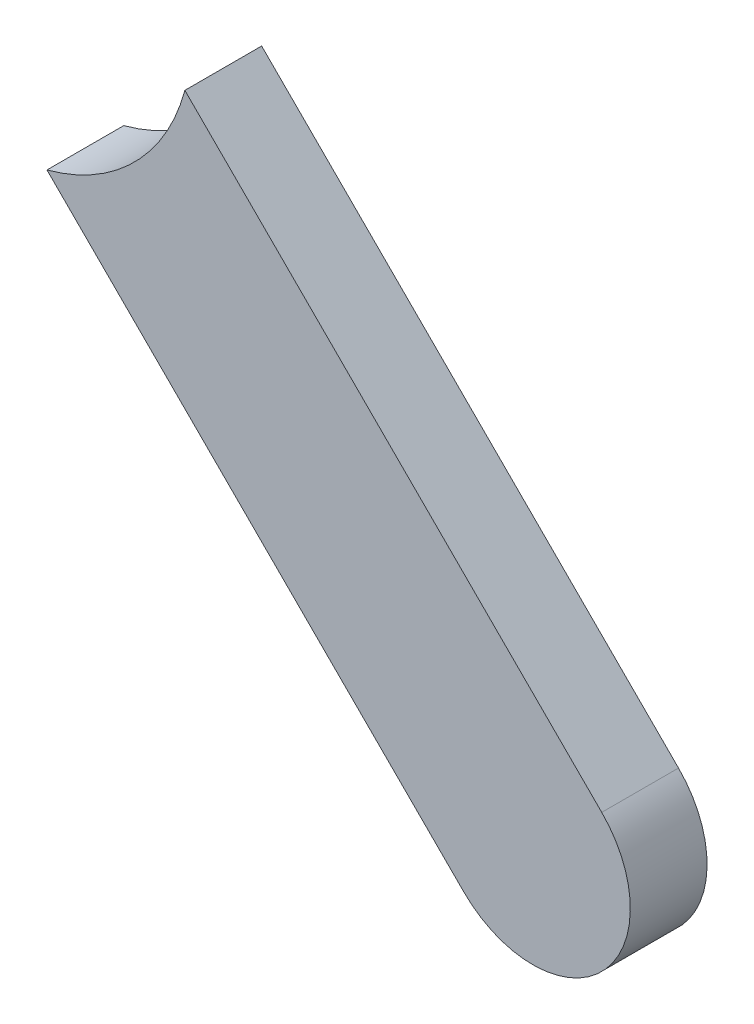
ISO-10303-21;
HEADER;
FILE_DESCRIPTION(('STEP AP214'),'2;1');
FILE_NAME('part.step','',(''),(''),'','','');
FILE_SCHEMA(('AUTOMOTIVE_DESIGN { 1 0 10303 214 1 1 1 1 }'));
ENDSEC;
DATA;
#1=APPLICATION_CONTEXT('core data for automotive mechanical design processes');
#2=APPLICATION_PROTOCOL_DEFINITION('international standard','automotive_design',2000,#1);
#3=PRODUCT_CONTEXT('',#1,'mechanical');
#4=PRODUCT('Part','Part','',(#3));
#5=PRODUCT_RELATED_PRODUCT_CATEGORY('part','',(#4));
#6=PRODUCT_DEFINITION_FORMATION('','',#4);
#7=PRODUCT_DEFINITION_CONTEXT('part definition',#1,'design');
#8=PRODUCT_DEFINITION('design','',#6,#7);
#9=PRODUCT_DEFINITION_SHAPE('','',#8);
#10=(LENGTH_UNIT() NAMED_UNIT(*) SI_UNIT(.MILLI.,.METRE.));
#11=(NAMED_UNIT(*) PLANE_ANGLE_UNIT() SI_UNIT($,.RADIAN.));
#12=(NAMED_UNIT(*) SI_UNIT($,.STERADIAN.) SOLID_ANGLE_UNIT());
#13=UNCERTAINTY_MEASURE_WITH_UNIT(LENGTH_MEASURE(1.E-05),#10,'distance_accuracy_value','');
#14=(GEOMETRIC_REPRESENTATION_CONTEXT(3) GLOBAL_UNCERTAINTY_ASSIGNED_CONTEXT((#13)) GLOBAL_UNIT_ASSIGNED_CONTEXT((#10,
#11,#12)) REPRESENTATION_CONTEXT('',''));
#15=CARTESIAN_POINT('',(0.,0.,0.));
#16=DIRECTION('',(0.,0.,1.));
#17=DIRECTION('',(1.,0.,0.));
#18=AXIS2_PLACEMENT_3D('',#15,#16,#17);
#19=CARTESIAN_POINT('',(90.3014807885386,117.492309871461,0.));
#20=DIRECTION('',(0.707106781186551,0.707106781186544,0.));
#21=DIRECTION('',(0.707106781186544,-0.707106781186551,0.));
#22=AXIS2_PLACEMENT_3D('',#19,#20,#21);
#23=PLANE('',#22);
#24=DIRECTION('',(0.707106781186544,-0.707106781186551,0.));
#25=VECTOR('',#24,1.);
#26=CARTESIAN_POINT('',(89.99039406,117.8033966,0.1999996));
#27=LINE('',#26,#25);
#28=CARTESIAN_POINT('',(90.3014807885386,117.492309871461,0.1999996));
#29=VERTEX_POINT('',#28);
#30=CARTESIAN_POINT('',(91.3873966,116.40639406,0.1999996));
#31=VERTEX_POINT('',#30);
#32=EDGE_CURVE('E11',#29,#31,#27,.T.);
#33=ORIENTED_EDGE('',*,*,#32,.F.);
#34=DIRECTION('',(0.,0.,1.));
#35=VECTOR('',#34,1.);
#36=CARTESIAN_POINT('',(90.3014807885386,117.492309871461,0.));
#37=LINE('',#36,#35);
#38=CARTESIAN_POINT('',(90.3014807885386,117.492309871461,0.));
#39=VERTEX_POINT('',#38);
#40=EDGE_CURVE('E24',#39,#29,#37,.T.);
#41=ORIENTED_EDGE('',*,*,#40,.F.);
#42=DIRECTION('',(0.707106781186544,-0.707106781186551,0.));
#43=VECTOR('',#42,1.);
#44=CARTESIAN_POINT('',(89.99039406,117.8033966,0.));
#45=LINE('',#44,#43);
#46=CARTESIAN_POINT('',(91.3873966,116.40639406,0.));
#47=VERTEX_POINT('',#46);
#48=EDGE_CURVE('E75',#39,#47,#45,.T.);
#49=ORIENTED_EDGE('',*,*,#48,.T.);
#50=DIRECTION('',(0.,0.,1.));
#51=VECTOR('',#50,1.);
#52=CARTESIAN_POINT('',(91.3873966,116.40639406,0.));
#53=LINE('',#52,#51);
#54=EDGE_CURVE('E37',#47,#31,#53,.T.);
#55=ORIENTED_EDGE('',*,*,#54,.T.);
#56=EDGE_LOOP('',(#33,#41,#49,#55));
#57=FACE_BOUND('',#56,.T.);
#58=ADVANCED_FACE('F17',(#57),#23,.F.);
#59=CARTESIAN_POINT('',(91.56700127,116.58599873,0.));
#60=DIRECTION('',(0.,0.,-1.));
#61=DIRECTION('',(-0.707106781186492,-0.707106781186604,0.));
#62=AXIS2_PLACEMENT_3D('',#59,#60,#61);
#63=CYLINDRICAL_SURFACE('',#62,0.253999360179552);
#64=CARTESIAN_POINT('',(91.56700127,116.58599873,0.1999996));
#65=DIRECTION('',(0.,0.,1.));
#66=DIRECTION('',(-0.707106781186492,-0.707106781186604,0.));
#67=AXIS2_PLACEMENT_3D('',#64,#65,#66);
#68=CIRCLE('',#67,0.253999360179552);
#69=CARTESIAN_POINT('',(91.74660594,116.7656034,0.1999996));
#70=VERTEX_POINT('',#69);
#71=EDGE_CURVE('E83',#31,#70,#68,.T.);
#72=ORIENTED_EDGE('',*,*,#71,.F.);
#73=ORIENTED_EDGE('',*,*,#54,.F.);
#74=CARTESIAN_POINT('',(91.56700127,116.58599873,0.));
#75=DIRECTION('',(0.,0.,1.));
#76=DIRECTION('',(-0.707106781186492,-0.707106781186604,0.));
#77=AXIS2_PLACEMENT_3D('',#74,#75,#76);
#78=CIRCLE('',#77,0.253999360179552);
#79=CARTESIAN_POINT('',(91.74660594,116.7656034,0.));
#80=VERTEX_POINT('',#79);
#81=EDGE_CURVE('E81',#47,#80,#78,.T.);
#82=ORIENTED_EDGE('',*,*,#81,.T.);
#83=DIRECTION('',(0.,0.,1.));
#84=VECTOR('',#83,1.);
#85=CARTESIAN_POINT('',(91.74660594,116.7656034,0.));
#86=LINE('',#85,#84);
#87=EDGE_CURVE('E67',#80,#70,#86,.T.);
#88=ORIENTED_EDGE('',*,*,#87,.T.);
#89=EDGE_LOOP('',(#72,#73,#82,#88));
#90=FACE_BOUND('',#89,.T.);
#91=ADVANCED_FACE('F89',(#90),#63,.T.);
#92=CARTESIAN_POINT('',(91.74660594,116.7656034,0.));
#93=DIRECTION('',(-0.707106781186544,-0.707106781186551,0.));
#94=DIRECTION('',(-0.707106781186551,0.707106781186544,0.));
#95=AXIS2_PLACEMENT_3D('',#92,#93,#94);
#96=PLANE('',#95);
#97=DIRECTION('',(-0.707106781186551,0.707106781186544,0.));
#98=VECTOR('',#97,1.);
#99=CARTESIAN_POINT('',(91.74660594,116.7656034,0.1999996));
#100=LINE('',#99,#98);
#101=CARTESIAN_POINT('',(90.6606901285386,117.851519211461,0.1999996));
#102=VERTEX_POINT('',#101);
#103=EDGE_CURVE('E71',#70,#102,#100,.T.);
#104=ORIENTED_EDGE('',*,*,#103,.F.);
#105=ORIENTED_EDGE('',*,*,#87,.F.);
#106=DIRECTION('',(-0.707106781186551,0.707106781186544,0.));
#107=VECTOR('',#106,1.);
#108=CARTESIAN_POINT('',(91.74660594,116.7656034,0.));
#109=LINE('',#108,#107);
#110=CARTESIAN_POINT('',(90.6606901285386,117.851519211461,0.));
#111=VERTEX_POINT('',#110);
#112=EDGE_CURVE('E63',#80,#111,#109,.T.);
#113=ORIENTED_EDGE('',*,*,#112,.T.);
#114=DIRECTION('',(0.,0.,1.));
#115=VECTOR('',#114,1.);
#116=CARTESIAN_POINT('',(90.6606901285386,117.851519211461,0.));
#117=LINE('',#116,#115);
#118=EDGE_CURVE('E53',#111,#102,#117,.T.);
#119=ORIENTED_EDGE('',*,*,#118,.T.);
#120=EDGE_LOOP('',(#104,#105,#113,#119));
#121=FACE_BOUND('',#120,.T.);
#122=ADVANCED_FACE('F66',(#121),#96,.F.);
#123=CARTESIAN_POINT('',(90.17,117.983,0.));
#124=DIRECTION('',(0.,0.,-1.));
#125=DIRECTION('',(1.,0.,0.));
#126=AXIS2_PLACEMENT_3D('',#123,#124,#125);
#127=CYLINDRICAL_SURFACE('',#126,0.508);
#128=ORIENTED_EDGE('',*,*,#40,.T.);
#129=CARTESIAN_POINT('',(90.17,117.983,0.1999996));
#130=DIRECTION('',(0.,0.,1.));
#131=DIRECTION('',(1.,0.,0.));
#132=AXIS2_PLACEMENT_3D('',#129,#130,#131);
#133=CIRCLE('',#132,0.508);
#134=EDGE_CURVE('E59',#29,#102,#133,.T.);
#135=ORIENTED_EDGE('',*,*,#134,.T.);
#136=ORIENTED_EDGE('',*,*,#118,.F.);
#137=CARTESIAN_POINT('',(90.17,117.983,0.));
#138=DIRECTION('',(0.,0.,1.));
#139=DIRECTION('',(1.,0.,0.));
#140=AXIS2_PLACEMENT_3D('',#137,#138,#139);
#141=CIRCLE('',#140,0.508);
#142=EDGE_CURVE('E57',#39,#111,#141,.T.);
#143=ORIENTED_EDGE('',*,*,#142,.F.);
#144=EDGE_LOOP('',(#128,#135,#136,#143));
#145=FACE_BOUND('',#144,.T.);
#146=ADVANCED_FACE('F55',(#145),#127,.F.);
#147=CARTESIAN_POINT('',(89.99039406,117.8033966,0.));
#148=DIRECTION('',(0.,0.,-1.));
#149=DIRECTION('',(-1.,0.,0.));
#150=AXIS2_PLACEMENT_3D('',#147,#148,#149);
#151=PLANE('',#150);
#152=ORIENTED_EDGE('',*,*,#48,.F.);
#153=ORIENTED_EDGE('',*,*,#142,.T.);
#154=ORIENTED_EDGE('',*,*,#112,.F.);
#155=ORIENTED_EDGE('',*,*,#81,.F.);
#156=EDGE_LOOP('',(#152,#153,#154,#155));
#157=FACE_BOUND('',#156,.T.);
#158=ADVANCED_FACE('F74',(#157),#151,.T.);
#159=CARTESIAN_POINT('',(89.99039406,117.8033966,0.1999996));
#160=DIRECTION('',(0.,0.,-1.));
#161=DIRECTION('',(-1.,0.,0.));
#162=AXIS2_PLACEMENT_3D('',#159,#160,#161);
#163=PLANE('',#162);
#164=ORIENTED_EDGE('',*,*,#134,.F.);
#165=ORIENTED_EDGE('',*,*,#32,.T.);
#166=ORIENTED_EDGE('',*,*,#71,.T.);
#167=ORIENTED_EDGE('',*,*,#103,.T.);
#168=EDGE_LOOP('',(#164,#165,#166,#167));
#169=FACE_BOUND('',#168,.T.);
#170=ADVANCED_FACE('F91',(#169),#163,.F.);
#171=CLOSED_SHELL('',(#58,#91,#122,#146,#158,#170));
#172=MANIFOLD_SOLID_BREP('B1',#171);
#173=ADVANCED_BREP_SHAPE_REPRESENTATION('',(#18,#172),#14);
#174=SHAPE_DEFINITION_REPRESENTATION(#9,#173);
ENDSEC;
END-ISO-10303-21;
